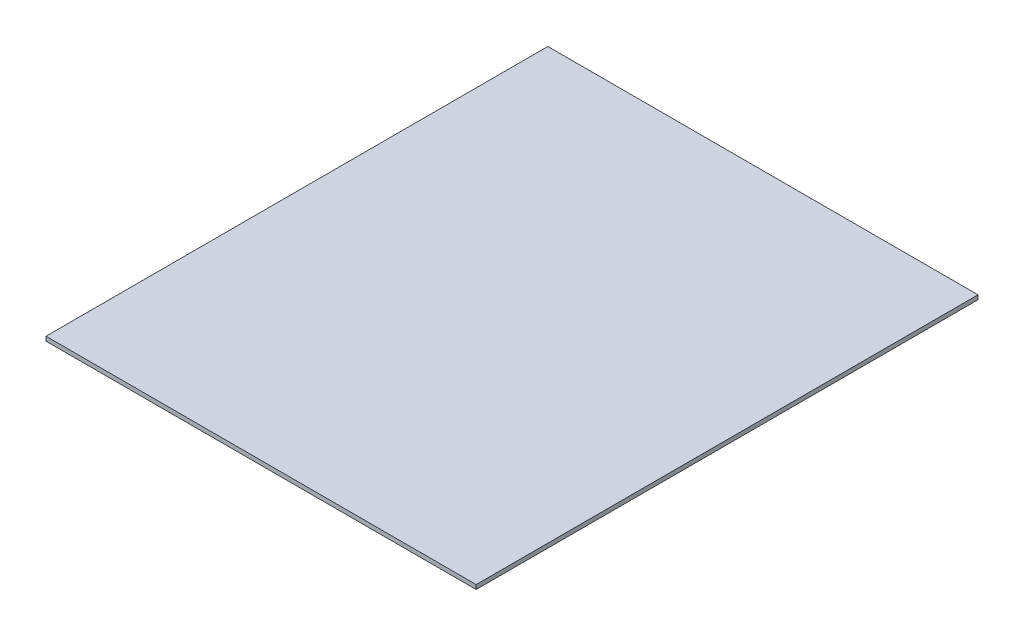
ISO-10303-21;
HEADER;
FILE_DESCRIPTION(('STEP AP214'),'2;1');
FILE_NAME('part.step','',(''),(''),'','','');
FILE_SCHEMA(('AUTOMOTIVE_DESIGN { 1 0 10303 214 1 1 1 1 }'));
ENDSEC;
DATA;
#1=APPLICATION_CONTEXT('core data for automotive mechanical design processes');
#2=APPLICATION_PROTOCOL_DEFINITION('international standard','automotive_design',2000,#1);
#3=PRODUCT_CONTEXT('',#1,'mechanical');
#4=PRODUCT('Part','Part','',(#3));
#5=PRODUCT_RELATED_PRODUCT_CATEGORY('part','',(#4));
#6=PRODUCT_DEFINITION_FORMATION('','',#4);
#7=PRODUCT_DEFINITION_CONTEXT('part definition',#1,'design');
#8=PRODUCT_DEFINITION('design','',#6,#7);
#9=PRODUCT_DEFINITION_SHAPE('','',#8);
#10=(LENGTH_UNIT() NAMED_UNIT(*) SI_UNIT(.MILLI.,.METRE.));
#11=(NAMED_UNIT(*) PLANE_ANGLE_UNIT() SI_UNIT($,.RADIAN.));
#12=(NAMED_UNIT(*) SI_UNIT($,.STERADIAN.) SOLID_ANGLE_UNIT());
#13=UNCERTAINTY_MEASURE_WITH_UNIT(LENGTH_MEASURE(1.E-05),#10,'distance_accuracy_value','');
#14=(GEOMETRIC_REPRESENTATION_CONTEXT(3) GLOBAL_UNCERTAINTY_ASSIGNED_CONTEXT((#13)) GLOBAL_UNIT_ASSIGNED_CONTEXT((#10,
#11,#12)) REPRESENTATION_CONTEXT('',''));
#15=CARTESIAN_POINT('',(0.,0.,0.));
#16=DIRECTION('',(0.,0.,1.));
#17=DIRECTION('',(1.,0.,0.));
#18=AXIS2_PLACEMENT_3D('',#15,#16,#17);
#19=CARTESIAN_POINT('',(150.,3.,-175.));
#20=DIRECTION('',(-1.,0.,0.));
#21=DIRECTION('',(0.,0.,1.));
#22=AXIS2_PLACEMENT_3D('',#19,#20,#21);
#23=PLANE('',#22);
#24=DIRECTION('',(0.,0.,-1.));
#25=VECTOR('',#24,1.);
#26=CARTESIAN_POINT('',(150.,0.,-175.));
#27=LINE('',#26,#25);
#28=CARTESIAN_POINT('',(150.,0.,175.));
#29=VERTEX_POINT('',#28);
#30=CARTESIAN_POINT('',(150.,0.,-175.));
#31=VERTEX_POINT('',#30);
#32=EDGE_CURVE('E113',#29,#31,#27,.T.);
#33=ORIENTED_EDGE('',*,*,#32,.T.);
#34=DIRECTION('',(0.,-1.,0.));
#35=VECTOR('',#34,1.);
#36=CARTESIAN_POINT('',(150.,3.,-175.));
#37=LINE('',#36,#35);
#38=CARTESIAN_POINT('',(150.,3.,-175.));
#39=VERTEX_POINT('',#38);
#40=EDGE_CURVE('E11',#39,#31,#37,.T.);
#41=ORIENTED_EDGE('',*,*,#40,.F.);
#42=DIRECTION('',(0.,0.,-1.));
#43=VECTOR('',#42,1.);
#44=CARTESIAN_POINT('',(150.,3.,-175.));
#45=LINE('',#44,#43);
#46=CARTESIAN_POINT('',(150.,3.,175.));
#47=VERTEX_POINT('',#46);
#48=EDGE_CURVE('E97',#47,#39,#45,.T.);
#49=ORIENTED_EDGE('',*,*,#48,.F.);
#50=DIRECTION('',(0.,-1.,0.));
#51=VECTOR('',#50,1.);
#52=CARTESIAN_POINT('',(150.,3.,175.));
#53=LINE('',#52,#51);
#54=EDGE_CURVE('E109',#47,#29,#53,.T.);
#55=ORIENTED_EDGE('',*,*,#54,.T.);
#56=EDGE_LOOP('',(#33,#41,#49,#55));
#57=FACE_BOUND('',#56,.T.);
#58=ADVANCED_FACE('F45',(#57),#23,.F.);
#59=CARTESIAN_POINT('',(-150.,3.,-175.));
#60=DIRECTION('',(0.,0.,1.));
#61=DIRECTION('',(1.,0.,0.));
#62=AXIS2_PLACEMENT_3D('',#59,#60,#61);
#63=PLANE('',#62);
#64=DIRECTION('',(-1.,0.,0.));
#65=VECTOR('',#64,1.);
#66=CARTESIAN_POINT('',(-150.,0.,-175.));
#67=LINE('',#66,#65);
#68=CARTESIAN_POINT('',(-150.,0.,-175.));
#69=VERTEX_POINT('',#68);
#70=EDGE_CURVE('E102',#31,#69,#67,.T.);
#71=ORIENTED_EDGE('',*,*,#70,.T.);
#72=DIRECTION('',(0.,-1.,0.));
#73=VECTOR('',#72,1.);
#74=CARTESIAN_POINT('',(-150.,3.,-175.));
#75=LINE('',#74,#73);
#76=CARTESIAN_POINT('',(-150.,3.,-175.));
#77=VERTEX_POINT('',#76);
#78=EDGE_CURVE('E54',#77,#69,#75,.T.);
#79=ORIENTED_EDGE('',*,*,#78,.F.);
#80=DIRECTION('',(-1.,0.,0.));
#81=VECTOR('',#80,1.);
#82=CARTESIAN_POINT('',(-150.,3.,-175.));
#83=LINE('',#82,#81);
#84=EDGE_CURVE('E92',#39,#77,#83,.T.);
#85=ORIENTED_EDGE('',*,*,#84,.F.);
#86=ORIENTED_EDGE('',*,*,#40,.T.);
#87=EDGE_LOOP('',(#71,#79,#85,#86));
#88=FACE_BOUND('',#87,.T.);
#89=ADVANCED_FACE('F101',(#88),#63,.F.);
#90=CARTESIAN_POINT('',(-150.,3.,-175.));
#91=DIRECTION('',(1.,0.,0.));
#92=DIRECTION('',(0.,0.,-1.));
#93=AXIS2_PLACEMENT_3D('',#90,#91,#92);
#94=PLANE('',#93);
#95=DIRECTION('',(0.,0.,1.));
#96=VECTOR('',#95,1.);
#97=CARTESIAN_POINT('',(-150.,0.,-175.));
#98=LINE('',#97,#96);
#99=CARTESIAN_POINT('',(-150.,0.,175.));
#100=VERTEX_POINT('',#99);
#101=EDGE_CURVE('E79',#69,#100,#98,.T.);
#102=ORIENTED_EDGE('',*,*,#101,.T.);
#103=DIRECTION('',(0.,-1.,0.));
#104=VECTOR('',#103,1.);
#105=CARTESIAN_POINT('',(-150.,3.,175.));
#106=LINE('',#105,#104);
#107=CARTESIAN_POINT('',(-150.,3.,175.));
#108=VERTEX_POINT('',#107);
#109=EDGE_CURVE('E104',#108,#100,#106,.T.);
#110=ORIENTED_EDGE('',*,*,#109,.F.);
#111=DIRECTION('',(0.,0.,1.));
#112=VECTOR('',#111,1.);
#113=CARTESIAN_POINT('',(-150.,3.,-175.));
#114=LINE('',#113,#112);
#115=EDGE_CURVE('E95',#77,#108,#114,.T.);
#116=ORIENTED_EDGE('',*,*,#115,.F.);
#117=ORIENTED_EDGE('',*,*,#78,.T.);
#118=EDGE_LOOP('',(#102,#110,#116,#117));
#119=FACE_BOUND('',#118,.T.);
#120=ADVANCED_FACE('F105',(#119),#94,.F.);
#121=CARTESIAN_POINT('',(-150.,3.,175.));
#122=DIRECTION('',(0.,0.,-1.));
#123=DIRECTION('',(-1.,0.,0.));
#124=AXIS2_PLACEMENT_3D('',#121,#122,#123);
#125=PLANE('',#124);
#126=DIRECTION('',(1.,0.,0.));
#127=VECTOR('',#126,1.);
#128=CARTESIAN_POINT('',(-150.,0.,175.));
#129=LINE('',#128,#127);
#130=EDGE_CURVE('E85',#100,#29,#129,.T.);
#131=ORIENTED_EDGE('',*,*,#130,.T.);
#132=ORIENTED_EDGE('',*,*,#54,.F.);
#133=DIRECTION('',(1.,0.,0.));
#134=VECTOR('',#133,1.);
#135=CARTESIAN_POINT('',(-150.,3.,175.));
#136=LINE('',#135,#134);
#137=EDGE_CURVE('E62',#108,#47,#136,.T.);
#138=ORIENTED_EDGE('',*,*,#137,.F.);
#139=ORIENTED_EDGE('',*,*,#109,.T.);
#140=EDGE_LOOP('',(#131,#132,#138,#139));
#141=FACE_BOUND('',#140,.T.);
#142=ADVANCED_FACE('F126',(#141),#125,.F.);
#143=CARTESIAN_POINT('',(0.,3.,0.));
#144=DIRECTION('',(0.,1.,0.));
#145=DIRECTION('',(0.,0.,1.));
#146=AXIS2_PLACEMENT_3D('',#143,#144,#145);
#147=PLANE('',#146);
#148=ORIENTED_EDGE('',*,*,#48,.T.);
#149=ORIENTED_EDGE('',*,*,#84,.T.);
#150=ORIENTED_EDGE('',*,*,#115,.T.);
#151=ORIENTED_EDGE('',*,*,#137,.T.);
#152=EDGE_LOOP('',(#148,#149,#150,#151));
#153=FACE_BOUND('',#152,.T.);
#154=ADVANCED_FACE('F93',(#153),#147,.T.);
#155=CARTESIAN_POINT('',(0.,0.,0.));
#156=DIRECTION('',(0.,1.,0.));
#157=DIRECTION('',(0.,0.,1.));
#158=AXIS2_PLACEMENT_3D('',#155,#156,#157);
#159=PLANE('',#158);
#160=ORIENTED_EDGE('',*,*,#32,.F.);
#161=ORIENTED_EDGE('',*,*,#130,.F.);
#162=ORIENTED_EDGE('',*,*,#101,.F.);
#163=ORIENTED_EDGE('',*,*,#70,.F.);
#164=EDGE_LOOP('',(#160,#161,#162,#163));
#165=FACE_BOUND('',#164,.T.);
#166=ADVANCED_FACE('F129',(#165),#159,.F.);
#167=CLOSED_SHELL('',(#58,#89,#120,#142,#154,#166));
#168=MANIFOLD_SOLID_BREP('B2',#167);
#169=ADVANCED_BREP_SHAPE_REPRESENTATION('',(#18,#168),#14);
#170=SHAPE_DEFINITION_REPRESENTATION(#9,#169);
ENDSEC;
END-ISO-10303-21;
